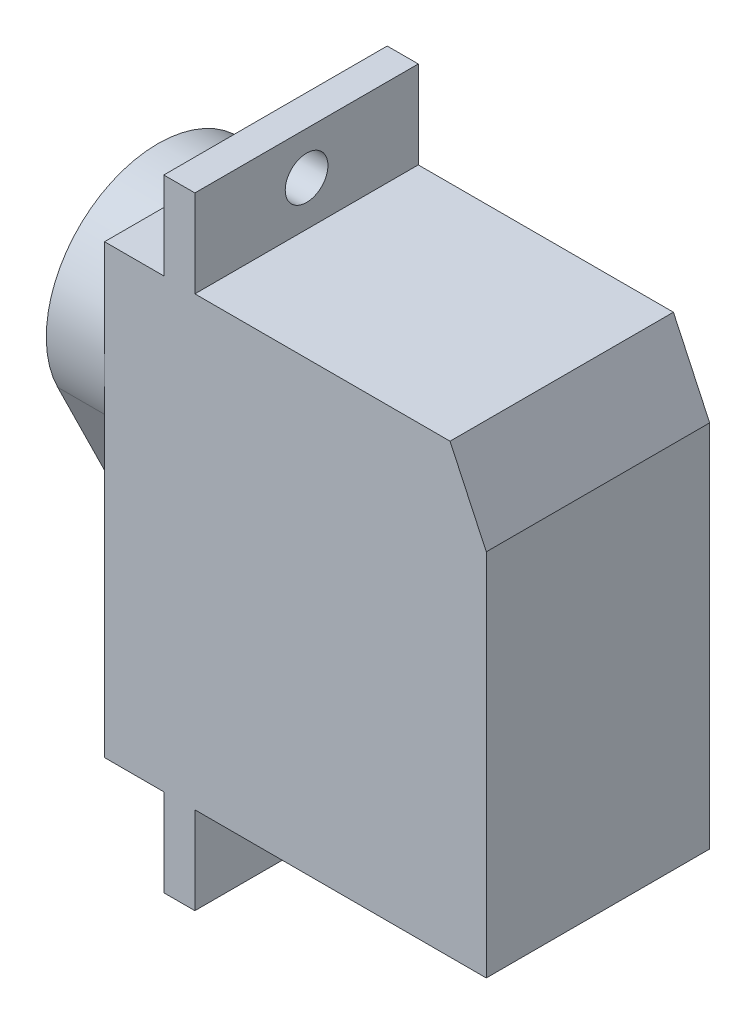
ISO-10303-21;
HEADER;
FILE_DESCRIPTION(('STEP AP214'),'2;1');
FILE_NAME('part.step','',(''),(''),'','','');
FILE_SCHEMA(('AUTOMOTIVE_DESIGN { 1 0 10303 214 1 1 1 1 }'));
ENDSEC;
DATA;
#1=APPLICATION_CONTEXT('core data for automotive mechanical design processes');
#2=APPLICATION_PROTOCOL_DEFINITION('international standard','automotive_design',2000,#1);
#3=PRODUCT_CONTEXT('',#1,'mechanical');
#4=PRODUCT('Part','Part','',(#3));
#5=PRODUCT_RELATED_PRODUCT_CATEGORY('part','',(#4));
#6=PRODUCT_DEFINITION_FORMATION('','',#4);
#7=PRODUCT_DEFINITION_CONTEXT('part definition',#1,'design');
#8=PRODUCT_DEFINITION('design','',#6,#7);
#9=PRODUCT_DEFINITION_SHAPE('','',#8);
#10=(LENGTH_UNIT() NAMED_UNIT(*) SI_UNIT(.MILLI.,.METRE.));
#11=(NAMED_UNIT(*) PLANE_ANGLE_UNIT() SI_UNIT($,.RADIAN.));
#12=(NAMED_UNIT(*) SI_UNIT($,.STERADIAN.) SOLID_ANGLE_UNIT());
#13=UNCERTAINTY_MEASURE_WITH_UNIT(LENGTH_MEASURE(1.E-05),#10,'distance_accuracy_value','');
#14=(GEOMETRIC_REPRESENTATION_CONTEXT(3) GLOBAL_UNCERTAINTY_ASSIGNED_CONTEXT((#13)) GLOBAL_UNIT_ASSIGNED_CONTEXT((#10,
#11,#12)) REPRESENTATION_CONTEXT('',''));
#15=CARTESIAN_POINT('',(0.,0.,0.));
#16=DIRECTION('',(0.,0.,1.));
#17=DIRECTION('',(1.,0.,0.));
#18=AXIS2_PLACEMENT_3D('',#15,#16,#17);
#19=CARTESIAN_POINT('',(-3.,17.25,5.75));
#20=DIRECTION('',(-1.,0.,0.));
#21=DIRECTION('',(0.,0.,1.));
#22=AXIS2_PLACEMENT_3D('',#19,#20,#21);
#23=PLANE('',#22);
#24=CARTESIAN_POINT('',(-3.,9.2,5.75));
#25=DIRECTION('',(-1.,0.,0.));
#26=DIRECTION('',(0.,0.,1.));
#27=AXIS2_PLACEMENT_3D('',#24,#25,#26);
#28=CIRCLE('',#27,1.1);
#29=CARTESIAN_POINT('',(-3.,9.2,6.85));
#30=VERTEX_POINT('',#29);
#31=EDGE_CURVE('E295',#30,#30,#28,.F.);
#32=ORIENTED_EDGE('',*,*,#31,.T.);
#33=EDGE_LOOP('',(#32));
#34=FACE_BOUND('',#33,.T.);
#35=CARTESIAN_POINT('',(-3.,17.25,5.75));
#36=DIRECTION('',(-1.,0.,0.));
#37=DIRECTION('',(0.,0.,1.));
#38=AXIS2_PLACEMENT_3D('',#35,#36,#37);
#39=CIRCLE('',#38,5.75);
#40=CARTESIAN_POINT('',(-3.,14.7142857142857,10.910683390911));
#41=VERTEX_POINT('',#40);
#42=CARTESIAN_POINT('',(-3.,14.7142857142857,0.589316609089016));
#43=VERTEX_POINT('',#42);
#44=EDGE_CURVE('E175',#41,#43,#39,.T.);
#45=ORIENTED_EDGE('',*,*,#44,.T.);
#46=DIRECTION('',(0.,-0.897510154941041,0.440993788819875));
#47=VECTOR('',#46,1.);
#48=CARTESIAN_POINT('',(-3.,14.7142857142857,0.589316609089016));
#49=LINE('',#48,#47);
#50=CARTESIAN_POINT('',(-3.,8.22981366459627,3.77547765912971));
#51=VERTEX_POINT('',#50);
#52=EDGE_CURVE('E164',#43,#51,#49,.T.);
#53=ORIENTED_EDGE('',*,*,#52,.T.);
#54=CARTESIAN_POINT('',(-3.,9.2,5.75));
#55=DIRECTION('',(-1.,0.,0.));
#56=DIRECTION('',(0.,0.,1.));
#57=AXIS2_PLACEMENT_3D('',#54,#55,#56);
#58=CIRCLE('',#57,2.2);
#59=CARTESIAN_POINT('',(-3.,8.22981366459627,7.72452234087029));
#60=VERTEX_POINT('',#59);
#61=EDGE_CURVE('E174',#51,#60,#58,.T.);
#62=ORIENTED_EDGE('',*,*,#61,.T.);
#63=DIRECTION('',(0.,0.897510154941041,0.440993788819876));
#64=VECTOR('',#63,1.);
#65=CARTESIAN_POINT('',(-3.,8.22981366459627,7.72452234087029));
#66=LINE('',#65,#64);
#67=EDGE_CURVE('E180',#60,#41,#66,.T.);
#68=ORIENTED_EDGE('',*,*,#67,.T.);
#69=EDGE_LOOP('',(#45,#53,#62,#68));
#70=FACE_BOUND('',#69,.T.);
#71=CARTESIAN_POINT('',(-3.,17.25,5.75));
#72=DIRECTION('',(-1.,0.,0.));
#73=DIRECTION('',(0.,0.,1.));
#74=AXIS2_PLACEMENT_3D('',#71,#72,#73);
#75=CIRCLE('',#74,2.);
#76=CARTESIAN_POINT('',(-3.,17.25,7.75));
#77=VERTEX_POINT('',#76);
#78=EDGE_CURVE('E467',#77,#77,#75,.T.);
#79=ORIENTED_EDGE('',*,*,#78,.F.);
#80=EDGE_LOOP('',(#79));
#81=FACE_BOUND('',#80,.T.);
#82=ADVANCED_FACE('F36',(#34,#70,#81),#23,.T.);
#83=CARTESIAN_POINT('',(0.,0.,11.5));
#84=DIRECTION('',(1.,0.,0.));
#85=DIRECTION('',(0.,0.,-1.));
#86=AXIS2_PLACEMENT_3D('',#83,#84,#85);
#87=PLANE('',#86);
#88=CARTESIAN_POINT('',(0.,17.25,5.75));
#89=DIRECTION('',(-1.,0.,0.));
#90=DIRECTION('',(0.,0.,1.));
#91=AXIS2_PLACEMENT_3D('',#88,#89,#90);
#92=CIRCLE('',#91,5.75);
#93=CARTESIAN_POINT('',(0.,14.7142857142857,10.910683390911));
#94=VERTEX_POINT('',#93);
#95=CARTESIAN_POINT('',(0.,17.25,11.5));
#96=VERTEX_POINT('',#95);
#97=EDGE_CURVE('E298',#94,#96,#92,.T.);
#98=ORIENTED_EDGE('',*,*,#97,.F.);
#99=DIRECTION('',(0.,0.897510154941041,0.440993788819876));
#100=VECTOR('',#99,1.);
#101=CARTESIAN_POINT('',(0.,8.22981366459627,7.72452234087029));
#102=LINE('',#101,#100);
#103=CARTESIAN_POINT('',(0.,8.22981366459627,7.72452234087029));
#104=VERTEX_POINT('',#103);
#105=EDGE_CURVE('E184',#104,#94,#102,.T.);
#106=ORIENTED_EDGE('',*,*,#105,.F.);
#107=CARTESIAN_POINT('',(0.,9.2,5.75));
#108=DIRECTION('',(-1.,0.,0.));
#109=DIRECTION('',(0.,0.,1.));
#110=AXIS2_PLACEMENT_3D('',#107,#108,#109);
#111=CIRCLE('',#110,2.2);
#112=CARTESIAN_POINT('',(0.,8.22981366459627,3.77547765912971));
#113=VERTEX_POINT('',#112);
#114=EDGE_CURVE('E313',#113,#104,#111,.T.);
#115=ORIENTED_EDGE('',*,*,#114,.F.);
#116=DIRECTION('',(0.,-0.897510154941041,0.440993788819875));
#117=VECTOR('',#116,1.);
#118=CARTESIAN_POINT('',(0.,14.7142857142857,0.589316609089016));
#119=LINE('',#118,#117);
#120=CARTESIAN_POINT('',(0.,14.7142857142857,0.589316609089016));
#121=VERTEX_POINT('',#120);
#122=EDGE_CURVE('E312',#121,#113,#119,.T.);
#123=ORIENTED_EDGE('',*,*,#122,.F.);
#124=CARTESIAN_POINT('',(0.,17.25,0.));
#125=VERTEX_POINT('',#124);
#126=EDGE_CURVE('E190',#125,#121,#92,.T.);
#127=ORIENTED_EDGE('',*,*,#126,.F.);
#128=DIRECTION('',(0.,-1.,0.));
#129=VECTOR('',#128,1.);
#130=CARTESIAN_POINT('',(0.,0.,0.));
#131=LINE('',#130,#129);
#132=CARTESIAN_POINT('',(0.,0.,0.));
#133=VERTEX_POINT('',#132);
#134=EDGE_CURVE('E206',#125,#133,#131,.T.);
#135=ORIENTED_EDGE('',*,*,#134,.T.);
#136=DIRECTION('',(0.,0.,-1.));
#137=VECTOR('',#136,1.);
#138=CARTESIAN_POINT('',(0.,0.,11.5));
#139=LINE('',#138,#137);
#140=CARTESIAN_POINT('',(0.,0.,11.5));
#141=VERTEX_POINT('',#140);
#142=EDGE_CURVE('E290',#141,#133,#139,.T.);
#143=ORIENTED_EDGE('',*,*,#142,.F.);
#144=DIRECTION('',(0.,-1.,0.));
#145=VECTOR('',#144,1.);
#146=CARTESIAN_POINT('',(0.,0.,11.5));
#147=LINE('',#146,#145);
#148=EDGE_CURVE('E211',#96,#141,#147,.T.);
#149=ORIENTED_EDGE('',*,*,#148,.F.);
#150=EDGE_LOOP('',(#98,#106,#115,#123,#127,#135,#143,#149));
#151=FACE_BOUND('',#150,.T.);
#152=ADVANCED_FACE('F327',(#151),#87,.F.);
#153=CARTESIAN_POINT('',(0.,23.,5.75));
#154=VERTEX_POINT('',#153);
#155=EDGE_CURVE('E303',#96,#154,#92,.T.);
#156=ORIENTED_EDGE('',*,*,#155,.F.);
#157=CARTESIAN_POINT('',(0.,23.,11.5));
#158=VERTEX_POINT('',#157);
#159=EDGE_CURVE('E207',#158,#96,#147,.T.);
#160=ORIENTED_EDGE('',*,*,#159,.F.);
#161=DIRECTION('',(0.,0.,-1.));
#162=VECTOR('',#161,1.);
#163=CARTESIAN_POINT('',(0.,23.,11.5));
#164=LINE('',#163,#162);
#165=EDGE_CURVE('E260',#158,#154,#164,.T.);
#166=ORIENTED_EDGE('',*,*,#165,.T.);
#167=EDGE_LOOP('',(#156,#160,#166));
#168=FACE_BOUND('',#167,.T.);
#169=ADVANCED_FACE('F337',(#168),#87,.F.);
#170=EDGE_CURVE('E308',#154,#125,#92,.T.);
#171=ORIENTED_EDGE('',*,*,#170,.F.);
#172=CARTESIAN_POINT('',(0.,23.,0.));
#173=VERTEX_POINT('',#172);
#174=EDGE_CURVE('E233',#154,#173,#164,.T.);
#175=ORIENTED_EDGE('',*,*,#174,.T.);
#176=EDGE_CURVE('E234',#173,#125,#131,.T.);
#177=ORIENTED_EDGE('',*,*,#176,.T.);
#178=EDGE_LOOP('',(#171,#175,#177));
#179=FACE_BOUND('',#178,.T.);
#180=ADVANCED_FACE('F344',(#179),#87,.F.);
#181=CARTESIAN_POINT('',(0.,0.,11.5));
#182=DIRECTION('',(0.,1.,0.));
#183=DIRECTION('',(0.,0.,1.));
#184=AXIS2_PLACEMENT_3D('',#181,#182,#183);
#185=PLANE('',#184);
#186=DIRECTION('',(1.,0.,0.));
#187=VECTOR('',#186,1.);
#188=CARTESIAN_POINT('',(0.,0.,0.));
#189=LINE('',#188,#187);
#190=CARTESIAN_POINT('',(3.05,0.,0.));
#191=VERTEX_POINT('',#190);
#192=EDGE_CURVE('E237',#133,#191,#189,.T.);
#193=ORIENTED_EDGE('',*,*,#192,.T.);
#194=DIRECTION('',(0.,0.,-1.));
#195=VECTOR('',#194,1.);
#196=CARTESIAN_POINT('',(3.05,0.,11.5));
#197=LINE('',#196,#195);
#198=CARTESIAN_POINT('',(3.05,0.,11.5));
#199=VERTEX_POINT('',#198);
#200=EDGE_CURVE('E287',#199,#191,#197,.T.);
#201=ORIENTED_EDGE('',*,*,#200,.F.);
#202=DIRECTION('',(1.,0.,0.));
#203=VECTOR('',#202,1.);
#204=CARTESIAN_POINT('',(0.,0.,11.5));
#205=LINE('',#204,#203);
#206=EDGE_CURVE('E210',#141,#199,#205,.T.);
#207=ORIENTED_EDGE('',*,*,#206,.F.);
#208=ORIENTED_EDGE('',*,*,#142,.T.);
#209=EDGE_LOOP('',(#193,#201,#207,#208));
#210=FACE_BOUND('',#209,.T.);
#211=ADVANCED_FACE('F353',(#210),#185,.F.);
#212=CARTESIAN_POINT('',(3.05,-4.5,11.5));
#213=DIRECTION('',(1.,0.,0.));
#214=DIRECTION('',(0.,0.,-1.));
#215=AXIS2_PLACEMENT_3D('',#212,#213,#214);
#216=PLANE('',#215);
#217=CARTESIAN_POINT('',(3.05,-2.3,5.75));
#218=DIRECTION('',(-1.,0.,0.));
#219=DIRECTION('',(0.,0.,1.));
#220=AXIS2_PLACEMENT_3D('',#217,#218,#219);
#221=CIRCLE('',#220,1.1);
#222=CARTESIAN_POINT('',(3.05,-2.3,6.85));
#223=VERTEX_POINT('',#222);
#224=EDGE_CURVE('E191',#223,#223,#221,.T.);
#225=ORIENTED_EDGE('',*,*,#224,.F.);
#226=EDGE_LOOP('',(#225));
#227=FACE_BOUND('',#226,.T.);
#228=DIRECTION('',(0.,-1.,0.));
#229=VECTOR('',#228,1.);
#230=CARTESIAN_POINT('',(3.05,-4.5,0.));
#231=LINE('',#230,#229);
#232=CARTESIAN_POINT('',(3.05,-4.5,0.));
#233=VERTEX_POINT('',#232);
#234=EDGE_CURVE('E239',#191,#233,#231,.T.);
#235=ORIENTED_EDGE('',*,*,#234,.T.);
#236=DIRECTION('',(0.,0.,-1.));
#237=VECTOR('',#236,1.);
#238=CARTESIAN_POINT('',(3.05,-4.5,11.5));
#239=LINE('',#238,#237);
#240=CARTESIAN_POINT('',(3.05,-4.5,11.5));
#241=VERTEX_POINT('',#240);
#242=EDGE_CURVE('E284',#241,#233,#239,.T.);
#243=ORIENTED_EDGE('',*,*,#242,.F.);
#244=DIRECTION('',(0.,-1.,0.));
#245=VECTOR('',#244,1.);
#246=CARTESIAN_POINT('',(3.05,-4.5,11.5));
#247=LINE('',#246,#245);
#248=EDGE_CURVE('E213',#199,#241,#247,.T.);
#249=ORIENTED_EDGE('',*,*,#248,.F.);
#250=ORIENTED_EDGE('',*,*,#200,.T.);
#251=EDGE_LOOP('',(#235,#243,#249,#250));
#252=FACE_BOUND('',#251,.T.);
#253=ADVANCED_FACE('F359',(#227,#252),#216,.F.);
#254=CARTESIAN_POINT('',(4.65,-4.5,11.5));
#255=DIRECTION('',(0.,1.,0.));
#256=DIRECTION('',(-1.,0.,0.));
#257=AXIS2_PLACEMENT_3D('',#254,#255,#256);
#258=PLANE('',#257);
#259=DIRECTION('',(1.,0.,0.));
#260=VECTOR('',#259,1.);
#261=CARTESIAN_POINT('',(4.65,-4.5,0.));
#262=LINE('',#261,#260);
#263=CARTESIAN_POINT('',(4.65,-4.5,0.));
#264=VERTEX_POINT('',#263);
#265=EDGE_CURVE('E241',#233,#264,#262,.T.);
#266=ORIENTED_EDGE('',*,*,#265,.T.);
#267=DIRECTION('',(0.,0.,-1.));
#268=VECTOR('',#267,1.);
#269=CARTESIAN_POINT('',(4.65,-4.5,11.5));
#270=LINE('',#269,#268);
#271=CARTESIAN_POINT('',(4.65,-4.5,11.5));
#272=VERTEX_POINT('',#271);
#273=EDGE_CURVE('E281',#272,#264,#270,.T.);
#274=ORIENTED_EDGE('',*,*,#273,.F.);
#275=DIRECTION('',(1.,0.,0.));
#276=VECTOR('',#275,1.);
#277=CARTESIAN_POINT('',(4.65,-4.5,11.5));
#278=LINE('',#277,#276);
#279=EDGE_CURVE('E215',#241,#272,#278,.T.);
#280=ORIENTED_EDGE('',*,*,#279,.F.);
#281=ORIENTED_EDGE('',*,*,#242,.T.);
#282=EDGE_LOOP('',(#266,#274,#280,#281));
#283=FACE_BOUND('',#282,.T.);
#284=ADVANCED_FACE('F361',(#283),#258,.F.);
#285=CARTESIAN_POINT('',(4.65,-4.5,11.5));
#286=DIRECTION('',(-1.,0.,0.));
#287=DIRECTION('',(0.,0.,1.));
#288=AXIS2_PLACEMENT_3D('',#285,#286,#287);
#289=PLANE('',#288);
#290=CARTESIAN_POINT('',(4.65,-2.3,5.75));
#291=DIRECTION('',(-1.,0.,0.));
#292=DIRECTION('',(0.,0.,1.));
#293=AXIS2_PLACEMENT_3D('',#290,#291,#292);
#294=CIRCLE('',#293,1.1);
#295=CARTESIAN_POINT('',(4.65,-2.3,6.85));
#296=VERTEX_POINT('',#295);
#297=EDGE_CURVE('E194',#296,#296,#294,.T.);
#298=ORIENTED_EDGE('',*,*,#297,.T.);
#299=EDGE_LOOP('',(#298));
#300=FACE_BOUND('',#299,.T.);
#301=DIRECTION('',(0.,1.,0.));
#302=VECTOR('',#301,1.);
#303=CARTESIAN_POINT('',(4.65,-4.5,0.));
#304=LINE('',#303,#302);
#305=CARTESIAN_POINT('',(4.65,0.,0.));
#306=VERTEX_POINT('',#305);
#307=EDGE_CURVE('E243',#264,#306,#304,.T.);
#308=ORIENTED_EDGE('',*,*,#307,.T.);
#309=DIRECTION('',(0.,0.,-1.));
#310=VECTOR('',#309,1.);
#311=CARTESIAN_POINT('',(4.65,0.,11.5));
#312=LINE('',#311,#310);
#313=CARTESIAN_POINT('',(4.65,0.,11.5));
#314=VERTEX_POINT('',#313);
#315=EDGE_CURVE('E278',#314,#306,#312,.T.);
#316=ORIENTED_EDGE('',*,*,#315,.F.);
#317=DIRECTION('',(0.,1.,0.));
#318=VECTOR('',#317,1.);
#319=CARTESIAN_POINT('',(4.65,-4.5,11.5));
#320=LINE('',#319,#318);
#321=EDGE_CURVE('E217',#272,#314,#320,.T.);
#322=ORIENTED_EDGE('',*,*,#321,.F.);
#323=ORIENTED_EDGE('',*,*,#273,.T.);
#324=EDGE_LOOP('',(#308,#316,#322,#323));
#325=FACE_BOUND('',#324,.T.);
#326=ADVANCED_FACE('F366',(#300,#325),#289,.F.);
#327=CARTESIAN_POINT('',(4.65,0.,11.5));
#328=DIRECTION('',(0.,1.,0.));
#329=DIRECTION('',(0.,0.,1.));
#330=AXIS2_PLACEMENT_3D('',#327,#328,#329);
#331=PLANE('',#330);
#332=DIRECTION('',(1.,0.,0.));
#333=VECTOR('',#332,1.);
#334=CARTESIAN_POINT('',(4.65,0.,0.));
#335=LINE('',#334,#333);
#336=CARTESIAN_POINT('',(19.65,0.,0.));
#337=VERTEX_POINT('',#336);
#338=EDGE_CURVE('E245',#306,#337,#335,.T.);
#339=ORIENTED_EDGE('',*,*,#338,.T.);
#340=DIRECTION('',(0.,0.,-1.));
#341=VECTOR('',#340,1.);
#342=CARTESIAN_POINT('',(19.65,0.,11.5));
#343=LINE('',#342,#341);
#344=CARTESIAN_POINT('',(19.65,0.,11.5));
#345=VERTEX_POINT('',#344);
#346=EDGE_CURVE('E275',#345,#337,#343,.T.);
#347=ORIENTED_EDGE('',*,*,#346,.F.);
#348=DIRECTION('',(1.,0.,0.));
#349=VECTOR('',#348,1.);
#350=CARTESIAN_POINT('',(4.65,0.,11.5));
#351=LINE('',#350,#349);
#352=EDGE_CURVE('E219',#314,#345,#351,.T.);
#353=ORIENTED_EDGE('',*,*,#352,.F.);
#354=ORIENTED_EDGE('',*,*,#315,.T.);
#355=EDGE_LOOP('',(#339,#347,#353,#354));
#356=FACE_BOUND('',#355,.T.);
#357=ADVANCED_FACE('F371',(#356),#331,.F.);
#358=CARTESIAN_POINT('',(19.65,0.,11.5));
#359=DIRECTION('',(-1.,0.,0.));
#360=DIRECTION('',(0.,0.,1.));
#361=AXIS2_PLACEMENT_3D('',#358,#359,#360);
#362=PLANE('',#361);
#363=DIRECTION('',(0.,1.,0.));
#364=VECTOR('',#363,1.);
#365=CARTESIAN_POINT('',(19.65,0.,0.));
#366=LINE('',#365,#364);
#367=CARTESIAN_POINT('',(19.65,19.,0.));
#368=VERTEX_POINT('',#367);
#369=EDGE_CURVE('E247',#337,#368,#366,.T.);
#370=ORIENTED_EDGE('',*,*,#369,.T.);
#371=DIRECTION('',(0.,0.,1.));
#372=VECTOR('',#371,1.);
#373=CARTESIAN_POINT('',(19.65,19.,11.5));
#374=LINE('',#373,#372);
#375=CARTESIAN_POINT('',(19.65,18.9999999999999,11.5));
#376=VERTEX_POINT('',#375);
#377=EDGE_CURVE('E44',#368,#376,#374,.T.);
#378=ORIENTED_EDGE('',*,*,#377,.T.);
#379=DIRECTION('',(0.,1.,0.));
#380=VECTOR('',#379,1.);
#381=CARTESIAN_POINT('',(19.65,0.,11.5));
#382=LINE('',#381,#380);
#383=EDGE_CURVE('E221',#345,#376,#382,.T.);
#384=ORIENTED_EDGE('',*,*,#383,.F.);
#385=ORIENTED_EDGE('',*,*,#346,.T.);
#386=EDGE_LOOP('',(#370,#378,#384,#385));
#387=FACE_BOUND('',#386,.T.);
#388=ADVANCED_FACE('F373',(#387),#362,.F.);
#389=CARTESIAN_POINT('',(4.65,23.,11.5));
#390=DIRECTION('',(0.,-1.,0.));
#391=DIRECTION('',(0.,0.,-1.));
#392=AXIS2_PLACEMENT_3D('',#389,#390,#391);
#393=PLANE('',#392);
#394=DIRECTION('',(-1.,0.,0.));
#395=VECTOR('',#394,1.);
#396=CARTESIAN_POINT('',(4.65,23.,11.5));
#397=LINE('',#396,#395);
#398=CARTESIAN_POINT('',(17.78476936738,23.,11.5));
#399=VERTEX_POINT('',#398);
#400=CARTESIAN_POINT('',(4.65,23.,11.5));
#401=VERTEX_POINT('',#400);
#402=EDGE_CURVE('E223',#399,#401,#397,.T.);
#403=ORIENTED_EDGE('',*,*,#402,.F.);
#404=DIRECTION('',(0.,0.,-1.));
#405=VECTOR('',#404,1.);
#406=CARTESIAN_POINT('',(17.78476936738,23.,11.5));
#407=LINE('',#406,#405);
#408=CARTESIAN_POINT('',(17.78476936738,23.,0.));
#409=VERTEX_POINT('',#408);
#410=EDGE_CURVE('E300',#399,#409,#407,.T.);
#411=ORIENTED_EDGE('',*,*,#410,.T.);
#412=DIRECTION('',(-1.,0.,0.));
#413=VECTOR('',#412,1.);
#414=CARTESIAN_POINT('',(4.65,23.,0.));
#415=LINE('',#414,#413);
#416=CARTESIAN_POINT('',(4.65,23.,0.));
#417=VERTEX_POINT('',#416);
#418=EDGE_CURVE('E249',#409,#417,#415,.T.);
#419=ORIENTED_EDGE('',*,*,#418,.T.);
#420=DIRECTION('',(0.,0.,-1.));
#421=VECTOR('',#420,1.);
#422=CARTESIAN_POINT('',(4.65,23.,11.5));
#423=LINE('',#422,#421);
#424=EDGE_CURVE('E272',#401,#417,#423,.T.);
#425=ORIENTED_EDGE('',*,*,#424,.F.);
#426=EDGE_LOOP('',(#403,#411,#419,#425));
#427=FACE_BOUND('',#426,.T.);
#428=ADVANCED_FACE('F375',(#427),#393,.F.);
#429=CARTESIAN_POINT('',(4.65,23.,11.5));
#430=DIRECTION('',(-1.,0.,0.));
#431=DIRECTION('',(0.,0.,1.));
#432=AXIS2_PLACEMENT_3D('',#429,#430,#431);
#433=PLANE('',#432);
#434=CARTESIAN_POINT('',(4.65,25.3,5.75));
#435=DIRECTION('',(-1.,0.,0.));
#436=DIRECTION('',(0.,0.,1.));
#437=AXIS2_PLACEMENT_3D('',#434,#435,#436);
#438=CIRCLE('',#437,1.1);
#439=CARTESIAN_POINT('',(4.65,25.3,6.85));
#440=VERTEX_POINT('',#439);
#441=EDGE_CURVE('E203',#440,#440,#438,.T.);
#442=ORIENTED_EDGE('',*,*,#441,.T.);
#443=EDGE_LOOP('',(#442));
#444=FACE_BOUND('',#443,.T.);
#445=DIRECTION('',(0.,1.,0.));
#446=VECTOR('',#445,1.);
#447=CARTESIAN_POINT('',(4.65,23.,0.));
#448=LINE('',#447,#446);
#449=CARTESIAN_POINT('',(4.65,27.5,0.));
#450=VERTEX_POINT('',#449);
#451=EDGE_CURVE('E251',#417,#450,#448,.T.);
#452=ORIENTED_EDGE('',*,*,#451,.T.);
#453=DIRECTION('',(0.,0.,-1.));
#454=VECTOR('',#453,1.);
#455=CARTESIAN_POINT('',(4.65,27.5,11.5));
#456=LINE('',#455,#454);
#457=CARTESIAN_POINT('',(4.65,27.5,11.5));
#458=VERTEX_POINT('',#457);
#459=EDGE_CURVE('E269',#458,#450,#456,.T.);
#460=ORIENTED_EDGE('',*,*,#459,.F.);
#461=DIRECTION('',(0.,1.,0.));
#462=VECTOR('',#461,1.);
#463=CARTESIAN_POINT('',(4.65,23.,11.5));
#464=LINE('',#463,#462);
#465=EDGE_CURVE('E225',#401,#458,#464,.T.);
#466=ORIENTED_EDGE('',*,*,#465,.F.);
#467=ORIENTED_EDGE('',*,*,#424,.T.);
#468=EDGE_LOOP('',(#452,#460,#466,#467));
#469=FACE_BOUND('',#468,.T.);
#470=ADVANCED_FACE('F381',(#444,#469),#433,.F.);
#471=CARTESIAN_POINT('',(4.65,27.5,11.5));
#472=DIRECTION('',(0.,-1.,0.));
#473=DIRECTION('',(0.,0.,-1.));
#474=AXIS2_PLACEMENT_3D('',#471,#472,#473);
#475=PLANE('',#474);
#476=DIRECTION('',(-1.,0.,0.));
#477=VECTOR('',#476,1.);
#478=CARTESIAN_POINT('',(4.65,27.5,0.));
#479=LINE('',#478,#477);
#480=CARTESIAN_POINT('',(3.05,27.5,0.));
#481=VERTEX_POINT('',#480);
#482=EDGE_CURVE('E253',#450,#481,#479,.T.);
#483=ORIENTED_EDGE('',*,*,#482,.T.);
#484=DIRECTION('',(0.,0.,-1.));
#485=VECTOR('',#484,1.);
#486=CARTESIAN_POINT('',(3.05,27.5,11.5));
#487=LINE('',#486,#485);
#488=CARTESIAN_POINT('',(3.05,27.5,11.5));
#489=VERTEX_POINT('',#488);
#490=EDGE_CURVE('E266',#489,#481,#487,.T.);
#491=ORIENTED_EDGE('',*,*,#490,.F.);
#492=DIRECTION('',(-1.,0.,0.));
#493=VECTOR('',#492,1.);
#494=CARTESIAN_POINT('',(4.65,27.5,11.5));
#495=LINE('',#494,#493);
#496=EDGE_CURVE('E227',#458,#489,#495,.T.);
#497=ORIENTED_EDGE('',*,*,#496,.F.);
#498=ORIENTED_EDGE('',*,*,#459,.T.);
#499=EDGE_LOOP('',(#483,#491,#497,#498));
#500=FACE_BOUND('',#499,.T.);
#501=ADVANCED_FACE('F419',(#500),#475,.F.);
#502=CARTESIAN_POINT('',(3.05,23.,11.5));
#503=DIRECTION('',(1.,0.,0.));
#504=DIRECTION('',(0.,0.,-1.));
#505=AXIS2_PLACEMENT_3D('',#502,#503,#504);
#506=PLANE('',#505);
#507=CARTESIAN_POINT('',(3.05,25.3,5.75));
#508=DIRECTION('',(-1.,0.,0.));
#509=DIRECTION('',(0.,0.,1.));
#510=AXIS2_PLACEMENT_3D('',#507,#508,#509);
#511=CIRCLE('',#510,1.1);
#512=CARTESIAN_POINT('',(3.05,25.3,6.85));
#513=VERTEX_POINT('',#512);
#514=EDGE_CURVE('E200',#513,#513,#511,.T.);
#515=ORIENTED_EDGE('',*,*,#514,.F.);
#516=EDGE_LOOP('',(#515));
#517=FACE_BOUND('',#516,.T.);
#518=DIRECTION('',(0.,-1.,0.));
#519=VECTOR('',#518,1.);
#520=CARTESIAN_POINT('',(3.05,23.,0.));
#521=LINE('',#520,#519);
#522=CARTESIAN_POINT('',(3.05,23.,0.));
#523=VERTEX_POINT('',#522);
#524=EDGE_CURVE('E255',#481,#523,#521,.T.);
#525=ORIENTED_EDGE('',*,*,#524,.T.);
#526=DIRECTION('',(0.,0.,-1.));
#527=VECTOR('',#526,1.);
#528=CARTESIAN_POINT('',(3.05,23.,11.5));
#529=LINE('',#528,#527);
#530=CARTESIAN_POINT('',(3.05,23.,11.5));
#531=VERTEX_POINT('',#530);
#532=EDGE_CURVE('E263',#531,#523,#529,.T.);
#533=ORIENTED_EDGE('',*,*,#532,.F.);
#534=DIRECTION('',(0.,-1.,0.));
#535=VECTOR('',#534,1.);
#536=CARTESIAN_POINT('',(3.05,23.,11.5));
#537=LINE('',#536,#535);
#538=EDGE_CURVE('E229',#489,#531,#537,.T.);
#539=ORIENTED_EDGE('',*,*,#538,.F.);
#540=ORIENTED_EDGE('',*,*,#490,.T.);
#541=EDGE_LOOP('',(#525,#533,#539,#540));
#542=FACE_BOUND('',#541,.T.);
#543=ADVANCED_FACE('F416',(#517,#542),#506,.F.);
#544=CARTESIAN_POINT('',(0.,23.,11.5));
#545=DIRECTION('',(0.,-1.,0.));
#546=DIRECTION('',(0.,0.,-1.));
#547=AXIS2_PLACEMENT_3D('',#544,#545,#546);
#548=PLANE('',#547);
#549=DIRECTION('',(-1.,0.,0.));
#550=VECTOR('',#549,1.);
#551=CARTESIAN_POINT('',(0.,23.,0.));
#552=LINE('',#551,#550);
#553=EDGE_CURVE('E257',#523,#173,#552,.T.);
#554=ORIENTED_EDGE('',*,*,#553,.T.);
#555=ORIENTED_EDGE('',*,*,#174,.F.);
#556=ORIENTED_EDGE('',*,*,#165,.F.);
#557=DIRECTION('',(-1.,0.,0.));
#558=VECTOR('',#557,1.);
#559=CARTESIAN_POINT('',(0.,23.,11.5));
#560=LINE('',#559,#558);
#561=EDGE_CURVE('E231',#531,#158,#560,.T.);
#562=ORIENTED_EDGE('',*,*,#561,.F.);
#563=ORIENTED_EDGE('',*,*,#532,.T.);
#564=EDGE_LOOP('',(#554,#555,#556,#562,#563));
#565=FACE_BOUND('',#564,.T.);
#566=ADVANCED_FACE('F340',(#565),#548,.F.);
#567=CARTESIAN_POINT('',(0.,0.,11.5));
#568=DIRECTION('',(0.,0.,-1.));
#569=DIRECTION('',(-1.,0.,0.));
#570=AXIS2_PLACEMENT_3D('',#567,#568,#569);
#571=PLANE('',#570);
#572=ORIENTED_EDGE('',*,*,#383,.T.);
#573=DIRECTION('',(0.422618261740697,-0.906307787036651,0.));
#574=VECTOR('',#573,1.);
#575=CARTESIAN_POINT('',(17.78476936738,23.,11.5));
#576=LINE('',#575,#574);
#577=EDGE_CURVE('E11',#376,#399,#576,.F.);
#578=ORIENTED_EDGE('',*,*,#577,.T.);
#579=ORIENTED_EDGE('',*,*,#402,.T.);
#580=ORIENTED_EDGE('',*,*,#465,.T.);
#581=ORIENTED_EDGE('',*,*,#496,.T.);
#582=ORIENTED_EDGE('',*,*,#538,.T.);
#583=ORIENTED_EDGE('',*,*,#561,.T.);
#584=ORIENTED_EDGE('',*,*,#159,.T.);
#585=ORIENTED_EDGE('',*,*,#148,.T.);
#586=ORIENTED_EDGE('',*,*,#206,.T.);
#587=ORIENTED_EDGE('',*,*,#248,.T.);
#588=ORIENTED_EDGE('',*,*,#279,.T.);
#589=ORIENTED_EDGE('',*,*,#321,.T.);
#590=ORIENTED_EDGE('',*,*,#352,.T.);
#591=EDGE_LOOP('',(#572,#578,#579,#580,#581,#582,#583,#584,#585,#586,#587,#588,#589,#590));
#592=FACE_BOUND('',#591,.T.);
#593=ADVANCED_FACE('F333',(#592),#571,.F.);
#594=CARTESIAN_POINT('',(0.,0.,0.));
#595=DIRECTION('',(0.,0.,-1.));
#596=DIRECTION('',(-1.,0.,0.));
#597=AXIS2_PLACEMENT_3D('',#594,#595,#596);
#598=PLANE('',#597);
#599=ORIENTED_EDGE('',*,*,#418,.F.);
#600=DIRECTION('',(-0.422618261740697,0.906307787036651,0.));
#601=VECTOR('',#600,1.);
#602=CARTESIAN_POINT('',(23.4178104748005,10.9199043616218,0.));
#603=LINE('',#602,#601);
#604=EDGE_CURVE('E58',#409,#368,#603,.F.);
#605=ORIENTED_EDGE('',*,*,#604,.T.);
#606=ORIENTED_EDGE('',*,*,#369,.F.);
#607=ORIENTED_EDGE('',*,*,#338,.F.);
#608=ORIENTED_EDGE('',*,*,#307,.F.);
#609=ORIENTED_EDGE('',*,*,#265,.F.);
#610=ORIENTED_EDGE('',*,*,#234,.F.);
#611=ORIENTED_EDGE('',*,*,#192,.F.);
#612=ORIENTED_EDGE('',*,*,#134,.F.);
#613=ORIENTED_EDGE('',*,*,#176,.F.);
#614=ORIENTED_EDGE('',*,*,#553,.F.);
#615=ORIENTED_EDGE('',*,*,#524,.F.);
#616=ORIENTED_EDGE('',*,*,#482,.F.);
#617=ORIENTED_EDGE('',*,*,#451,.F.);
#618=EDGE_LOOP('',(#599,#605,#606,#607,#608,#609,#610,#611,#612,#613,#614,#615,#616,#617));
#619=FACE_BOUND('',#618,.T.);
#620=ADVANCED_FACE('F346',(#619),#598,.T.);
#621=CARTESIAN_POINT('',(19.65,25.3,5.75));
#622=DIRECTION('',(-1.,0.,0.));
#623=DIRECTION('',(0.,0.,1.));
#624=AXIS2_PLACEMENT_3D('',#621,#622,#623);
#625=CYLINDRICAL_SURFACE('',#624,1.1);
#626=CARTESIAN_POINT('',(3.05,25.3,6.85));
#627=CARTESIAN_POINT('',(3.06666666666666,25.3,6.85));
#628=CARTESIAN_POINT('',(3.08333333333333,25.3,6.85));
#629=CARTESIAN_POINT('',(3.11666666666666,25.3,6.85));
#630=CARTESIAN_POINT('',(3.13333333333333,25.3,6.85));
#631=CARTESIAN_POINT('',(3.16666666666666,25.3,6.85));
#632=CARTESIAN_POINT('',(3.18333333333333,25.3,6.85));
#633=CARTESIAN_POINT('',(3.21666666666666,25.3,6.85));
#634=CARTESIAN_POINT('',(3.23333333333333,25.3,6.85));
#635=CARTESIAN_POINT('',(3.26666666666666,25.3,6.85));
#636=CARTESIAN_POINT('',(3.28333333333333,25.3,6.85));
#637=CARTESIAN_POINT('',(3.31666666666666,25.3,6.85));
#638=CARTESIAN_POINT('',(3.33333333333333,25.3,6.85));
#639=CARTESIAN_POINT('',(3.36666666666666,25.3,6.85));
#640=CARTESIAN_POINT('',(3.38333333333333,25.3,6.85));
#641=CARTESIAN_POINT('',(3.41666666666666,25.3,6.85));
#642=CARTESIAN_POINT('',(3.43333333333333,25.3,6.85));
#643=CARTESIAN_POINT('',(3.46666666666667,25.3,6.85));
#644=CARTESIAN_POINT('',(3.48333333333333,25.3,6.85));
#645=CARTESIAN_POINT('',(3.51666666666667,25.3,6.85));
#646=CARTESIAN_POINT('',(3.53333333333333,25.3,6.85));
#647=CARTESIAN_POINT('',(3.56666666666666,25.3,6.85));
#648=CARTESIAN_POINT('',(3.58333333333333,25.3,6.85));
#649=CARTESIAN_POINT('',(3.61666666666667,25.3,6.85));
#650=CARTESIAN_POINT('',(3.63333333333333,25.3,6.85));
#651=CARTESIAN_POINT('',(3.66666666666667,25.3,6.85));
#652=CARTESIAN_POINT('',(3.68333333333333,25.3,6.85));
#653=CARTESIAN_POINT('',(3.71666666666667,25.3,6.85));
#654=CARTESIAN_POINT('',(3.73333333333333,25.3,6.85));
#655=CARTESIAN_POINT('',(3.76666666666667,25.3,6.85));
#656=CARTESIAN_POINT('',(3.78333333333333,25.3,6.85));
#657=CARTESIAN_POINT('',(3.81666666666666,25.3,6.85));
#658=CARTESIAN_POINT('',(3.83333333333333,25.3,6.85));
#659=CARTESIAN_POINT('',(3.86666666666667,25.3,6.85));
#660=CARTESIAN_POINT('',(3.88333333333333,25.3,6.85));
#661=CARTESIAN_POINT('',(3.91666666666667,25.3,6.85));
#662=CARTESIAN_POINT('',(3.93333333333333,25.3,6.85));
#663=CARTESIAN_POINT('',(3.96666666666667,25.3,6.85));
#664=CARTESIAN_POINT('',(3.98333333333333,25.3,6.85));
#665=CARTESIAN_POINT('',(4.01666666666667,25.3,6.85));
#666=CARTESIAN_POINT('',(4.03333333333333,25.3,6.85));
#667=CARTESIAN_POINT('',(4.06666666666666,25.3,6.85));
#668=CARTESIAN_POINT('',(4.08333333333333,25.3,6.85));
#669=CARTESIAN_POINT('',(4.11666666666667,25.3,6.85));
#670=CARTESIAN_POINT('',(4.13333333333333,25.3,6.85));
#671=CARTESIAN_POINT('',(4.16666666666667,25.3,6.85));
#672=CARTESIAN_POINT('',(4.18333333333333,25.3,6.85));
#673=CARTESIAN_POINT('',(4.21666666666667,25.3,6.85));
#674=CARTESIAN_POINT('',(4.23333333333333,25.3,6.85));
#675=CARTESIAN_POINT('',(4.26666666666666,25.3,6.85));
#676=CARTESIAN_POINT('',(4.28333333333333,25.3,6.85));
#677=CARTESIAN_POINT('',(4.31666666666666,25.3,6.85));
#678=CARTESIAN_POINT('',(4.33333333333333,25.3,6.85));
#679=CARTESIAN_POINT('',(4.36666666666667,25.3,6.85));
#680=CARTESIAN_POINT('',(4.38333333333333,25.3,6.85));
#681=CARTESIAN_POINT('',(4.41666666666667,25.3,6.85));
#682=CARTESIAN_POINT('',(4.43333333333333,25.3,6.85));
#683=CARTESIAN_POINT('',(4.46666666666667,25.3,6.85));
#684=CARTESIAN_POINT('',(4.48333333333333,25.3,6.85));
#685=CARTESIAN_POINT('',(4.51666666666667,25.3,6.85));
#686=CARTESIAN_POINT('',(4.53333333333333,25.3,6.85));
#687=CARTESIAN_POINT('',(4.56666666666667,25.3,6.85));
#688=CARTESIAN_POINT('',(4.58333333333333,25.3,6.85));
#689=CARTESIAN_POINT('',(4.61666666666667,25.3,6.85));
#690=CARTESIAN_POINT('',(4.63333333333333,25.3,6.85));
#691=CARTESIAN_POINT('',(4.65,25.3,6.85));
#692=B_SPLINE_CURVE_WITH_KNOTS('',3,(#626,#627,#628,#629,#630,#631,#632,#633,#634,#635,#636,
#637,#638,#639,#640,#641,#642,#643,#644,#645,#646,#647,#648,#649,#650,#651,#652,#653,#654,#655,
#656,#657,#658,#659,#660,#661,#662,#663,#664,#665,#666,#667,#668,#669,#670,#671,#672,#673,#674,
#675,#676,#677,#678,#679,#680,#681,#682,#683,#684,#685,#686,#687,#688,#689,#690,#691),
.UNSPECIFIED.,.F.,.F.,(4,2,2,2,2,2,2,2,2,2,2,2,2,2,2,2,2,2,2,2,2,2,2,2,2,2,2,2,2,2,2,2,4),(0.,
0.0500000000000014,0.0999999999999994,0.150000000000001,0.199999999999999,0.25,
0.300000000000002,0.35,0.400000000000001,0.450000000000003,0.5,0.550000000000002,
0.600000000000003,0.650000000000001,0.700000000000003,0.750000000000001,0.800000000000002,
0.850000000000004,0.900000000000001,0.950000000000003,1.,1.05,1.1,1.15,1.2,1.25,1.3,1.35,1.4,
1.45,1.5,1.55,1.6),.UNSPECIFIED.);
#693=EDGE_CURVE('BSEAM405',#513,#440,#692,.T.);
#694=ORIENTED_EDGE('',*,*,#514,.T.);
#695=ORIENTED_EDGE('',*,*,#441,.F.);
#696=ORIENTED_EDGE('',*,*,#693,.T.);
#697=ORIENTED_EDGE('',*,*,#693,.F.);
#698=EDGE_LOOP('',(#694,#696,#695,#697));
#699=FACE_BOUND('',#698,.T.);
#700=ADVANCED_FACE('F405',(#699),#625,.F.);
#701=CARTESIAN_POINT('',(19.65,-2.3,5.75));
#702=DIRECTION('',(-1.,0.,0.));
#703=DIRECTION('',(0.,0.,1.));
#704=AXIS2_PLACEMENT_3D('',#701,#702,#703);
#705=CYLINDRICAL_SURFACE('',#704,1.1);
#706=CARTESIAN_POINT('',(3.05,-2.3,6.85));
#707=CARTESIAN_POINT('',(3.06666666666666,-2.3,6.85));
#708=CARTESIAN_POINT('',(3.08333333333333,-2.3,6.85));
#709=CARTESIAN_POINT('',(3.11666666666666,-2.3,6.85));
#710=CARTESIAN_POINT('',(3.13333333333333,-2.3,6.85));
#711=CARTESIAN_POINT('',(3.16666666666666,-2.3,6.85));
#712=CARTESIAN_POINT('',(3.18333333333333,-2.3,6.85));
#713=CARTESIAN_POINT('',(3.21666666666666,-2.3,6.85));
#714=CARTESIAN_POINT('',(3.23333333333333,-2.3,6.85));
#715=CARTESIAN_POINT('',(3.26666666666666,-2.3,6.85));
#716=CARTESIAN_POINT('',(3.28333333333333,-2.3,6.85));
#717=CARTESIAN_POINT('',(3.31666666666666,-2.3,6.85));
#718=CARTESIAN_POINT('',(3.33333333333333,-2.3,6.85));
#719=CARTESIAN_POINT('',(3.36666666666666,-2.3,6.85));
#720=CARTESIAN_POINT('',(3.38333333333333,-2.3,6.85));
#721=CARTESIAN_POINT('',(3.41666666666666,-2.3,6.85));
#722=CARTESIAN_POINT('',(3.43333333333333,-2.3,6.85));
#723=CARTESIAN_POINT('',(3.46666666666667,-2.3,6.85));
#724=CARTESIAN_POINT('',(3.48333333333333,-2.3,6.85));
#725=CARTESIAN_POINT('',(3.51666666666667,-2.3,6.85));
#726=CARTESIAN_POINT('',(3.53333333333333,-2.3,6.85));
#727=CARTESIAN_POINT('',(3.56666666666666,-2.3,6.85));
#728=CARTESIAN_POINT('',(3.58333333333333,-2.3,6.85));
#729=CARTESIAN_POINT('',(3.61666666666667,-2.3,6.85));
#730=CARTESIAN_POINT('',(3.63333333333333,-2.3,6.85));
#731=CARTESIAN_POINT('',(3.66666666666667,-2.3,6.85));
#732=CARTESIAN_POINT('',(3.68333333333333,-2.3,6.85));
#733=CARTESIAN_POINT('',(3.71666666666667,-2.3,6.85));
#734=CARTESIAN_POINT('',(3.73333333333333,-2.3,6.85));
#735=CARTESIAN_POINT('',(3.76666666666667,-2.3,6.85));
#736=CARTESIAN_POINT('',(3.78333333333333,-2.3,6.85));
#737=CARTESIAN_POINT('',(3.81666666666666,-2.3,6.85));
#738=CARTESIAN_POINT('',(3.83333333333333,-2.3,6.85));
#739=CARTESIAN_POINT('',(3.86666666666667,-2.3,6.85));
#740=CARTESIAN_POINT('',(3.88333333333333,-2.3,6.85));
#741=CARTESIAN_POINT('',(3.91666666666667,-2.3,6.85));
#742=CARTESIAN_POINT('',(3.93333333333333,-2.3,6.85));
#743=CARTESIAN_POINT('',(3.96666666666667,-2.3,6.85));
#744=CARTESIAN_POINT('',(3.98333333333333,-2.3,6.85));
#745=CARTESIAN_POINT('',(4.01666666666667,-2.3,6.85));
#746=CARTESIAN_POINT('',(4.03333333333333,-2.3,6.85));
#747=CARTESIAN_POINT('',(4.06666666666666,-2.3,6.85));
#748=CARTESIAN_POINT('',(4.08333333333333,-2.3,6.85));
#749=CARTESIAN_POINT('',(4.11666666666667,-2.3,6.85));
#750=CARTESIAN_POINT('',(4.13333333333333,-2.3,6.85));
#751=CARTESIAN_POINT('',(4.16666666666667,-2.3,6.85));
#752=CARTESIAN_POINT('',(4.18333333333333,-2.3,6.85));
#753=CARTESIAN_POINT('',(4.21666666666667,-2.3,6.85));
#754=CARTESIAN_POINT('',(4.23333333333333,-2.3,6.85));
#755=CARTESIAN_POINT('',(4.26666666666666,-2.3,6.85));
#756=CARTESIAN_POINT('',(4.28333333333333,-2.3,6.85));
#757=CARTESIAN_POINT('',(4.31666666666666,-2.3,6.85));
#758=CARTESIAN_POINT('',(4.33333333333333,-2.3,6.85));
#759=CARTESIAN_POINT('',(4.36666666666667,-2.3,6.85));
#760=CARTESIAN_POINT('',(4.38333333333333,-2.3,6.85));
#761=CARTESIAN_POINT('',(4.41666666666667,-2.3,6.85));
#762=CARTESIAN_POINT('',(4.43333333333333,-2.3,6.85));
#763=CARTESIAN_POINT('',(4.46666666666667,-2.3,6.85));
#764=CARTESIAN_POINT('',(4.48333333333333,-2.3,6.85));
#765=CARTESIAN_POINT('',(4.51666666666667,-2.3,6.85));
#766=CARTESIAN_POINT('',(4.53333333333333,-2.3,6.85));
#767=CARTESIAN_POINT('',(4.56666666666667,-2.3,6.85));
#768=CARTESIAN_POINT('',(4.58333333333333,-2.3,6.85));
#769=CARTESIAN_POINT('',(4.61666666666667,-2.3,6.85));
#770=CARTESIAN_POINT('',(4.63333333333333,-2.3,6.85));
#771=CARTESIAN_POINT('',(4.65,-2.3,6.85));
#772=B_SPLINE_CURVE_WITH_KNOTS('',3,(#706,#707,#708,#709,#710,#711,#712,#713,#714,#715,#716,
#717,#718,#719,#720,#721,#722,#723,#724,#725,#726,#727,#728,#729,#730,#731,#732,#733,#734,#735,
#736,#737,#738,#739,#740,#741,#742,#743,#744,#745,#746,#747,#748,#749,#750,#751,#752,#753,#754,
#755,#756,#757,#758,#759,#760,#761,#762,#763,#764,#765,#766,#767,#768,#769,#770,#771),
.UNSPECIFIED.,.F.,.F.,(4,2,2,2,2,2,2,2,2,2,2,2,2,2,2,2,2,2,2,2,2,2,2,2,2,2,2,2,2,2,2,2,4),(0.,
0.0500000000000014,0.0999999999999994,0.150000000000001,0.199999999999999,0.25,
0.300000000000002,0.35,0.400000000000001,0.450000000000003,0.5,0.550000000000002,
0.600000000000003,0.650000000000001,0.700000000000003,0.750000000000001,0.800000000000002,
0.850000000000004,0.900000000000001,0.950000000000003,1.,1.05,1.1,1.15,1.2,1.25,1.3,1.35,1.4,
1.45,1.5,1.55,1.6),.UNSPECIFIED.);
#773=EDGE_CURVE('BSEAM402',#223,#296,#772,.T.);
#774=ORIENTED_EDGE('',*,*,#224,.T.);
#775=ORIENTED_EDGE('',*,*,#297,.F.);
#776=ORIENTED_EDGE('',*,*,#773,.T.);
#777=ORIENTED_EDGE('',*,*,#773,.F.);
#778=EDGE_LOOP('',(#774,#776,#775,#777));
#779=FACE_BOUND('',#778,.T.);
#780=ADVANCED_FACE('F402',(#779),#705,.F.);
#781=CARTESIAN_POINT('',(-3.,17.25,5.75));
#782=DIRECTION('',(1.,0.,0.));
#783=DIRECTION('',(0.,0.,-1.));
#784=AXIS2_PLACEMENT_3D('',#781,#782,#783);
#785=CYLINDRICAL_SURFACE('',#784,5.75);
#786=ORIENTED_EDGE('',*,*,#97,.T.);
#787=ORIENTED_EDGE('',*,*,#155,.T.);
#788=ORIENTED_EDGE('',*,*,#170,.T.);
#789=ORIENTED_EDGE('',*,*,#126,.T.);
#790=DIRECTION('',(1.,0.,0.));
#791=VECTOR('',#790,1.);
#792=CARTESIAN_POINT('',(-3.,14.7142857142857,0.589316609089016));
#793=LINE('',#792,#791);
#794=EDGE_CURVE('E169',#43,#121,#793,.T.);
#795=ORIENTED_EDGE('',*,*,#794,.F.);
#796=ORIENTED_EDGE('',*,*,#44,.F.);
#797=DIRECTION('',(1.,0.,0.));
#798=VECTOR('',#797,1.);
#799=CARTESIAN_POINT('',(-3.,14.7142857142857,10.910683390911));
#800=LINE('',#799,#798);
#801=EDGE_CURVE('E319',#41,#94,#800,.T.);
#802=ORIENTED_EDGE('',*,*,#801,.T.);
#803=EDGE_LOOP('',(#786,#787,#788,#789,#795,#796,#802));
#804=FACE_BOUND('',#803,.T.);
#805=ADVANCED_FACE('F188',(#804),#785,.T.);
#806=CARTESIAN_POINT('',(-3.,14.7142857142857,0.589316609089016));
#807=DIRECTION('',(0.,0.440993788819875,0.897510154941041));
#808=DIRECTION('',(0.,-0.897510154941041,0.440993788819875));
#809=AXIS2_PLACEMENT_3D('',#806,#807,#808);
#810=PLANE('',#809);
#811=ORIENTED_EDGE('',*,*,#122,.T.);
#812=DIRECTION('',(1.,0.,0.));
#813=VECTOR('',#812,1.);
#814=CARTESIAN_POINT('',(-3.,8.22981366459627,3.77547765912971));
#815=LINE('',#814,#813);
#816=EDGE_CURVE('E171',#51,#113,#815,.T.);
#817=ORIENTED_EDGE('',*,*,#816,.F.);
#818=ORIENTED_EDGE('',*,*,#52,.F.);
#819=ORIENTED_EDGE('',*,*,#794,.T.);
#820=EDGE_LOOP('',(#811,#817,#818,#819));
#821=FACE_BOUND('',#820,.T.);
#822=ADVANCED_FACE('F167',(#821),#810,.F.);
#823=CARTESIAN_POINT('',(-3.,9.2,5.75));
#824=DIRECTION('',(1.,0.,0.));
#825=DIRECTION('',(0.,0.,-1.));
#826=AXIS2_PLACEMENT_3D('',#823,#824,#825);
#827=CYLINDRICAL_SURFACE('',#826,2.2);
#828=ORIENTED_EDGE('',*,*,#114,.T.);
#829=DIRECTION('',(1.,0.,0.));
#830=VECTOR('',#829,1.);
#831=CARTESIAN_POINT('',(-3.,8.22981366459627,7.72452234087029));
#832=LINE('',#831,#830);
#833=EDGE_CURVE('E196',#60,#104,#832,.T.);
#834=ORIENTED_EDGE('',*,*,#833,.F.);
#835=ORIENTED_EDGE('',*,*,#61,.F.);
#836=ORIENTED_EDGE('',*,*,#816,.T.);
#837=EDGE_LOOP('',(#828,#834,#835,#836));
#838=FACE_BOUND('',#837,.T.);
#839=ADVANCED_FACE('F325',(#838),#827,.T.);
#840=CARTESIAN_POINT('',(-3.,8.22981366459627,7.72452234087029));
#841=DIRECTION('',(0.,0.440993788819876,-0.89751015494104));
#842=DIRECTION('',(0.,0.897510154941041,0.440993788819876));
#843=AXIS2_PLACEMENT_3D('',#840,#841,#842);
#844=PLANE('',#843);
#845=ORIENTED_EDGE('',*,*,#105,.T.);
#846=ORIENTED_EDGE('',*,*,#801,.F.);
#847=ORIENTED_EDGE('',*,*,#67,.F.);
#848=ORIENTED_EDGE('',*,*,#833,.T.);
#849=EDGE_LOOP('',(#845,#846,#847,#848));
#850=FACE_BOUND('',#849,.T.);
#851=ADVANCED_FACE('F323',(#850),#844,.F.);
#852=CARTESIAN_POINT('',(-3.6,9.2,5.75));
#853=DIRECTION('',(1.,0.,0.));
#854=DIRECTION('',(0.,0.,-1.));
#855=AXIS2_PLACEMENT_3D('',#852,#853,#854);
#856=CYLINDRICAL_SURFACE('',#855,1.1);
#857=ORIENTED_EDGE('',*,*,#31,.F.);
#858=EDGE_LOOP('',(#857));
#859=FACE_BOUND('',#858,.T.);
#860=CARTESIAN_POINT('',(-3.6,9.2,5.75));
#861=DIRECTION('',(-1.,0.,0.));
#862=DIRECTION('',(0.,0.,1.));
#863=AXIS2_PLACEMENT_3D('',#860,#861,#862);
#864=CIRCLE('',#863,1.1);
#865=CARTESIAN_POINT('',(-3.6,9.2,6.85));
#866=VERTEX_POINT('',#865);
#867=EDGE_CURVE('E299',#866,#866,#864,.T.);
#868=ORIENTED_EDGE('',*,*,#867,.F.);
#869=EDGE_LOOP('',(#868));
#870=FACE_BOUND('',#869,.T.);
#871=ADVANCED_FACE('F392',(#859,#870),#856,.T.);
#872=CARTESIAN_POINT('',(-3.6,9.2,5.75));
#873=DIRECTION('',(-1.,0.,0.));
#874=DIRECTION('',(0.,0.,1.));
#875=AXIS2_PLACEMENT_3D('',#872,#873,#874);
#876=PLANE('',#875);
#877=ORIENTED_EDGE('',*,*,#867,.T.);
#878=EDGE_LOOP('',(#877));
#879=FACE_BOUND('',#878,.T.);
#880=ADVANCED_FACE('F452',(#879),#876,.T.);
#881=CARTESIAN_POINT('',(-5.,17.25,5.75));
#882=DIRECTION('',(1.,0.,0.));
#883=DIRECTION('',(0.,0.,-1.));
#884=AXIS2_PLACEMENT_3D('',#881,#882,#883);
#885=CYLINDRICAL_SURFACE('',#884,2.);
#886=CARTESIAN_POINT('',(-5.,17.25,5.75));
#887=DIRECTION('',(-1.,0.,0.));
#888=DIRECTION('',(0.,0.,1.));
#889=AXIS2_PLACEMENT_3D('',#886,#887,#888);
#890=CIRCLE('',#889,2.);
#891=CARTESIAN_POINT('',(-5.,17.25,7.75));
#892=VERTEX_POINT('',#891);
#893=EDGE_CURVE('E465',#892,#892,#890,.T.);
#894=ORIENTED_EDGE('',*,*,#893,.F.);
#895=EDGE_LOOP('',(#894));
#896=FACE_BOUND('',#895,.T.);
#897=ORIENTED_EDGE('',*,*,#78,.T.);
#898=EDGE_LOOP('',(#897));
#899=FACE_BOUND('',#898,.T.);
#900=ADVANCED_FACE('F446',(#896,#899),#885,.T.);
#901=CARTESIAN_POINT('',(-5.,17.25,5.75));
#902=DIRECTION('',(-1.,0.,0.));
#903=DIRECTION('',(0.,0.,1.));
#904=AXIS2_PLACEMENT_3D('',#901,#902,#903);
#905=PLANE('',#904);
#906=ORIENTED_EDGE('',*,*,#893,.T.);
#907=EDGE_LOOP('',(#906));
#908=FACE_BOUND('',#907,.T.);
#909=ADVANCED_FACE('F442',(#908),#905,.T.);
#910=CARTESIAN_POINT('',(17.78476936738,23.,11.5));
#911=DIRECTION('',(-0.906307787036651,-0.422618261740697,0.));
#912=DIRECTION('',(0.,0.,-1.));
#913=AXIS2_PLACEMENT_3D('',#910,#911,#912);
#914=PLANE('',#913);
#915=ORIENTED_EDGE('',*,*,#577,.F.);
#916=ORIENTED_EDGE('',*,*,#377,.F.);
#917=ORIENTED_EDGE('',*,*,#604,.F.);
#918=ORIENTED_EDGE('',*,*,#410,.F.);
#919=EDGE_LOOP('',(#915,#916,#917,#918));
#920=FACE_BOUND('',#919,.T.);
#921=ADVANCED_FACE('F38',(#920),#914,.F.);
#922=CLOSED_SHELL('',(#82,#152,#169,#180,#211,#253,#284,#326,#357,#388,#428,#470,#501,#543,#566,
#593,#620,#700,#780,#805,#822,#839,#851,#871,#880,#900,#909,#921));
#923=MANIFOLD_SOLID_BREP('B2',#922);
#924=ADVANCED_BREP_SHAPE_REPRESENTATION('',(#18,#923),#14);
#925=SHAPE_DEFINITION_REPRESENTATION(#9,#924);
ENDSEC;
END-ISO-10303-21;
